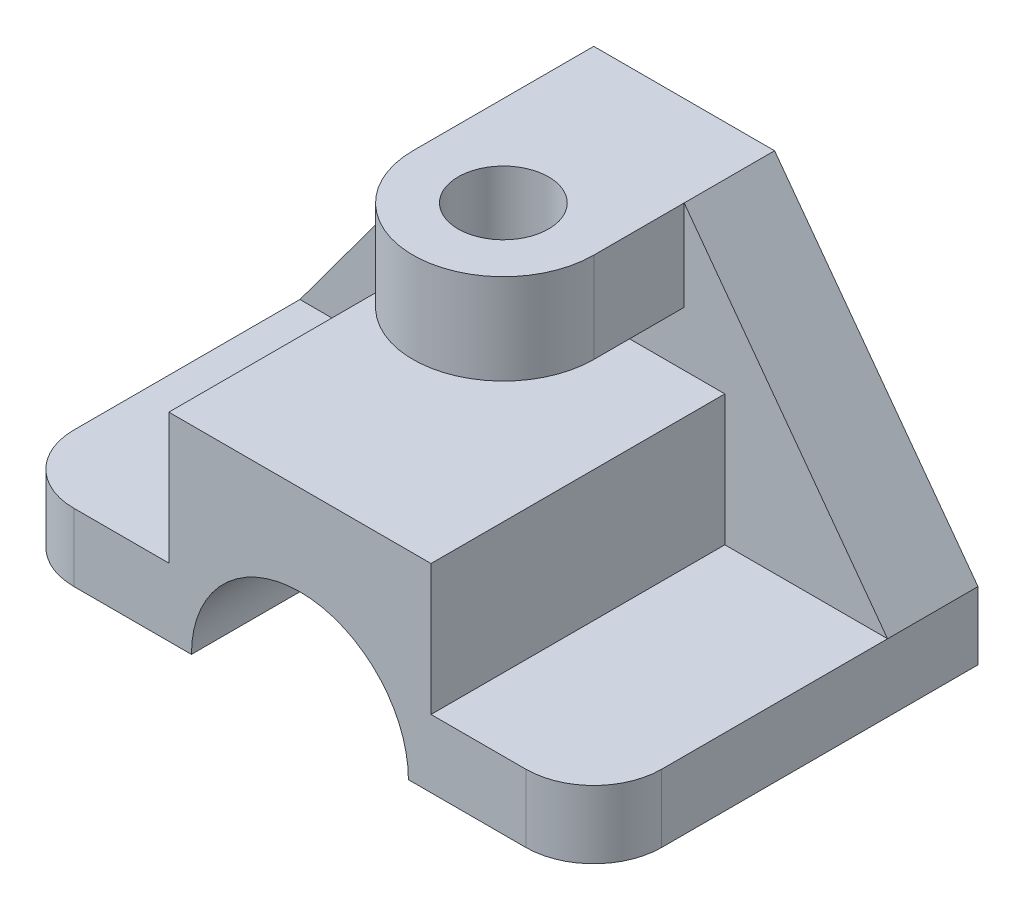
ISO-10303-21;
HEADER;
FILE_DESCRIPTION(('STEP AP214'),'2;1');
FILE_NAME('part.step','',(''),(''),'','','');
FILE_SCHEMA(('AUTOMOTIVE_DESIGN { 1 0 10303 214 1 1 1 1 }'));
ENDSEC;
DATA;
#1=APPLICATION_CONTEXT('core data for automotive mechanical design processes');
#2=APPLICATION_PROTOCOL_DEFINITION('international standard','automotive_design',2000,#1);
#3=PRODUCT_CONTEXT('',#1,'mechanical');
#4=PRODUCT('Part','Part','',(#3));
#5=PRODUCT_RELATED_PRODUCT_CATEGORY('part','',(#4));
#6=PRODUCT_DEFINITION_FORMATION('','',#4);
#7=PRODUCT_DEFINITION_CONTEXT('part definition',#1,'design');
#8=PRODUCT_DEFINITION('design','',#6,#7);
#9=PRODUCT_DEFINITION_SHAPE('','',#8);
#10=(LENGTH_UNIT() NAMED_UNIT(*) SI_UNIT(.MILLI.,.METRE.));
#11=(NAMED_UNIT(*) PLANE_ANGLE_UNIT() SI_UNIT($,.RADIAN.));
#12=(NAMED_UNIT(*) SI_UNIT($,.STERADIAN.) SOLID_ANGLE_UNIT());
#13=UNCERTAINTY_MEASURE_WITH_UNIT(LENGTH_MEASURE(1.E-05),#10,'distance_accuracy_value','');
#14=(GEOMETRIC_REPRESENTATION_CONTEXT(3) GLOBAL_UNCERTAINTY_ASSIGNED_CONTEXT((#13)) GLOBAL_UNIT_ASSIGNED_CONTEXT((#10,
#11,#12)) REPRESENTATION_CONTEXT('',''));
#15=CARTESIAN_POINT('',(0.,0.,0.));
#16=DIRECTION('',(0.,0.,1.));
#17=DIRECTION('',(1.,0.,0.));
#18=AXIS2_PLACEMENT_3D('',#15,#16,#17);
#19=CARTESIAN_POINT('',(-65.,0.,85.));
#20=DIRECTION('',(0.,1.,0.));
#21=DIRECTION('',(0.,0.,1.));
#22=AXIS2_PLACEMENT_3D('',#19,#20,#21);
#23=PLANE('',#22);
#24=DIRECTION('',(0.,0.,-1.));
#25=VECTOR('',#24,1.);
#26=CARTESIAN_POINT('',(65.,0.,85.));
#27=LINE('',#26,#25);
#28=CARTESIAN_POINT('',(65.,0.,70.));
#29=VERTEX_POINT('',#28);
#30=CARTESIAN_POINT('',(65.,0.,0.));
#31=VERTEX_POINT('',#30);
#32=EDGE_CURVE('E321',#29,#31,#27,.T.);
#33=ORIENTED_EDGE('',*,*,#32,.F.);
#34=CARTESIAN_POINT('',(50.,0.,70.));
#35=DIRECTION('',(0.,1.,0.));
#36=DIRECTION('',(0.,0.,1.));
#37=AXIS2_PLACEMENT_3D('',#34,#35,#36);
#38=CIRCLE('',#37,15.);
#39=CARTESIAN_POINT('',(50.,0.,85.));
#40=VERTEX_POINT('',#39);
#41=EDGE_CURVE('E354',#29,#40,#38,.F.);
#42=ORIENTED_EDGE('',*,*,#41,.T.);
#43=DIRECTION('',(1.,0.,0.));
#44=VECTOR('',#43,1.);
#45=CARTESIAN_POINT('',(-65.,0.,85.));
#46=LINE('',#45,#44);
#47=CARTESIAN_POINT('',(24.,0.,85.));
#48=VERTEX_POINT('',#47);
#49=EDGE_CURVE('E272',#48,#40,#46,.T.);
#50=ORIENTED_EDGE('',*,*,#49,.F.);
#51=DIRECTION('',(0.,0.,-1.));
#52=VECTOR('',#51,1.);
#53=CARTESIAN_POINT('',(24.,0.,393.014777533669));
#54=LINE('',#53,#52);
#55=CARTESIAN_POINT('',(24.,0.,0.));
#56=VERTEX_POINT('',#55);
#57=EDGE_CURVE('E247',#48,#56,#54,.T.);
#58=ORIENTED_EDGE('',*,*,#57,.T.);
#59=DIRECTION('',(1.,0.,0.));
#60=VECTOR('',#59,1.);
#61=CARTESIAN_POINT('',(-65.,0.,0.));
#62=LINE('',#61,#60);
#63=EDGE_CURVE('E292',#56,#31,#62,.T.);
#64=ORIENTED_EDGE('',*,*,#63,.T.);
#65=EDGE_LOOP('',(#33,#42,#50,#58,#64));
#66=FACE_BOUND('',#65,.T.);
#67=ADVANCED_FACE('F39',(#66),#23,.F.);
#68=CARTESIAN_POINT('',(-50.,0.,85.));
#69=VERTEX_POINT('',#68);
#70=CARTESIAN_POINT('',(-24.,0.,85.));
#71=VERTEX_POINT('',#70);
#72=EDGE_CURVE('E268',#69,#71,#46,.T.);
#73=ORIENTED_EDGE('',*,*,#72,.F.);
#74=CARTESIAN_POINT('',(-50.,0.,70.));
#75=DIRECTION('',(0.,1.,0.));
#76=DIRECTION('',(0.,0.,1.));
#77=AXIS2_PLACEMENT_3D('',#74,#75,#76);
#78=CIRCLE('',#77,15.);
#79=CARTESIAN_POINT('',(-65.,0.,70.));
#80=VERTEX_POINT('',#79);
#81=EDGE_CURVE('E62',#69,#80,#78,.F.);
#82=ORIENTED_EDGE('',*,*,#81,.T.);
#83=DIRECTION('',(0.,0.,-1.));
#84=VECTOR('',#83,1.);
#85=CARTESIAN_POINT('',(-65.,0.,85.));
#86=LINE('',#85,#84);
#87=CARTESIAN_POINT('',(-65.,0.,0.));
#88=VERTEX_POINT('',#87);
#89=EDGE_CURVE('E324',#80,#88,#86,.T.);
#90=ORIENTED_EDGE('',*,*,#89,.T.);
#91=CARTESIAN_POINT('',(-24.,0.,0.));
#92=VERTEX_POINT('',#91);
#93=EDGE_CURVE('E293',#88,#92,#62,.T.);
#94=ORIENTED_EDGE('',*,*,#93,.T.);
#95=DIRECTION('',(0.,0.,-1.));
#96=VECTOR('',#95,1.);
#97=CARTESIAN_POINT('',(-24.,0.,393.014777533669));
#98=LINE('',#97,#96);
#99=EDGE_CURVE('E257',#71,#92,#98,.T.);
#100=ORIENTED_EDGE('',*,*,#99,.F.);
#101=EDGE_LOOP('',(#73,#82,#90,#94,#100));
#102=FACE_BOUND('',#101,.T.);
#103=ADVANCED_FACE('F407',(#102),#23,.F.);
#104=CARTESIAN_POINT('',(0.,0.,85.));
#105=DIRECTION('',(0.,0.,1.));
#106=DIRECTION('',(1.,0.,0.));
#107=AXIS2_PLACEMENT_3D('',#104,#105,#106);
#108=PLANE('',#107);
#109=ORIENTED_EDGE('',*,*,#49,.T.);
#110=DIRECTION('',(0.,1.,0.));
#111=VECTOR('',#110,1.);
#112=CARTESIAN_POINT('',(50.,15.,85.));
#113=LINE('',#112,#111);
#114=CARTESIAN_POINT('',(50.,15.,85.));
#115=VERTEX_POINT('',#114);
#116=EDGE_CURVE('E344',#40,#115,#113,.T.);
#117=ORIENTED_EDGE('',*,*,#116,.T.);
#118=DIRECTION('',(-1.,0.,0.));
#119=VECTOR('',#118,1.);
#120=CARTESIAN_POINT('',(65.,15.,85.));
#121=LINE('',#120,#119);
#122=CARTESIAN_POINT('',(29.,15.,85.));
#123=VERTEX_POINT('',#122);
#124=EDGE_CURVE('E271',#115,#123,#121,.T.);
#125=ORIENTED_EDGE('',*,*,#124,.T.);
#126=DIRECTION('',(0.,1.,0.));
#127=VECTOR('',#126,1.);
#128=CARTESIAN_POINT('',(29.,15.,85.));
#129=LINE('',#128,#127);
#130=CARTESIAN_POINT('',(29.,43.9178356713427,85.));
#131=VERTEX_POINT('',#130);
#132=EDGE_CURVE('E275',#123,#131,#129,.T.);
#133=ORIENTED_EDGE('',*,*,#132,.T.);
#134=DIRECTION('',(-1.,0.,0.));
#135=VECTOR('',#134,1.);
#136=CARTESIAN_POINT('',(29.,43.9178356713427,85.));
#137=LINE('',#136,#135);
#138=CARTESIAN_POINT('',(-29.,43.9178356713427,85.));
#139=VERTEX_POINT('',#138);
#140=EDGE_CURVE('E278',#131,#139,#137,.T.);
#141=ORIENTED_EDGE('',*,*,#140,.T.);
#142=DIRECTION('',(0.,-1.,0.));
#143=VECTOR('',#142,1.);
#144=CARTESIAN_POINT('',(-29.,43.9178356713427,85.));
#145=LINE('',#144,#143);
#146=CARTESIAN_POINT('',(-29.,15.,85.));
#147=VERTEX_POINT('',#146);
#148=EDGE_CURVE('E281',#139,#147,#145,.T.);
#149=ORIENTED_EDGE('',*,*,#148,.T.);
#150=DIRECTION('',(-1.,0.,0.));
#151=VECTOR('',#150,1.);
#152=CARTESIAN_POINT('',(-29.,15.,85.));
#153=LINE('',#152,#151);
#154=CARTESIAN_POINT('',(-50.,15.,85.));
#155=VERTEX_POINT('',#154);
#156=EDGE_CURVE('E284',#147,#155,#153,.T.);
#157=ORIENTED_EDGE('',*,*,#156,.T.);
#158=DIRECTION('',(0.,-1.,0.));
#159=VECTOR('',#158,1.);
#160=CARTESIAN_POINT('',(-50.,0.,85.));
#161=LINE('',#160,#159);
#162=EDGE_CURVE('E340',#155,#69,#161,.T.);
#163=ORIENTED_EDGE('',*,*,#162,.T.);
#164=ORIENTED_EDGE('',*,*,#72,.T.);
#165=CARTESIAN_POINT('',(0.,0.,85.));
#166=DIRECTION('',(0.,0.,1.));
#167=DIRECTION('',(1.,0.,0.));
#168=AXIS2_PLACEMENT_3D('',#165,#166,#167);
#169=CIRCLE('',#168,24.);
#170=EDGE_CURVE('E261',#71,#48,#169,.F.);
#171=ORIENTED_EDGE('',*,*,#170,.T.);
#172=EDGE_LOOP('',(#109,#117,#125,#133,#141,#149,#157,#163,#164,#171));
#173=FACE_BOUND('',#172,.T.);
#174=ADVANCED_FACE('F396',(#173),#108,.T.);
#175=CARTESIAN_POINT('',(0.,0.,0.));
#176=DIRECTION('',(0.,0.,1.));
#177=DIRECTION('',(1.,0.,0.));
#178=AXIS2_PLACEMENT_3D('',#175,#176,#177);
#179=PLANE('',#178);
#180=DIRECTION('',(1.,0.,0.));
#181=VECTOR('',#180,1.);
#182=CARTESIAN_POINT('',(20.,76.,0.));
#183=LINE('',#182,#181);
#184=CARTESIAN_POINT('',(-20.,76.,0.));
#185=VERTEX_POINT('',#184);
#186=CARTESIAN_POINT('',(20.,76.,0.));
#187=VERTEX_POINT('',#186);
#188=EDGE_CURVE('E236',#185,#187,#183,.T.);
#189=ORIENTED_EDGE('',*,*,#188,.T.);
#190=DIRECTION('',(0.593648948570223,-0.80472413028408,0.));
#191=VECTOR('',#190,1.);
#192=CARTESIAN_POINT('',(65.,15.,0.));
#193=LINE('',#192,#191);
#194=CARTESIAN_POINT('',(65.,15.,0.));
#195=VERTEX_POINT('',#194);
#196=EDGE_CURVE('E211',#187,#195,#193,.T.);
#197=ORIENTED_EDGE('',*,*,#196,.T.);
#198=DIRECTION('',(0.,1.,0.));
#199=VECTOR('',#198,1.);
#200=CARTESIAN_POINT('',(65.,0.,0.));
#201=LINE('',#200,#199);
#202=EDGE_CURVE('E297',#31,#195,#201,.T.);
#203=ORIENTED_EDGE('',*,*,#202,.F.);
#204=ORIENTED_EDGE('',*,*,#63,.F.);
#205=CARTESIAN_POINT('',(0.,0.,0.));
#206=DIRECTION('',(0.,0.,1.));
#207=DIRECTION('',(1.,0.,0.));
#208=AXIS2_PLACEMENT_3D('',#205,#206,#207);
#209=CIRCLE('',#208,24.);
#210=EDGE_CURVE('E327',#92,#56,#209,.F.);
#211=ORIENTED_EDGE('',*,*,#210,.F.);
#212=ORIENTED_EDGE('',*,*,#93,.F.);
#213=DIRECTION('',(0.,-1.,0.));
#214=VECTOR('',#213,1.);
#215=CARTESIAN_POINT('',(-65.,15.,0.));
#216=LINE('',#215,#214);
#217=CARTESIAN_POINT('',(-65.,15.,0.));
#218=VERTEX_POINT('',#217);
#219=EDGE_CURVE('E267',#218,#88,#216,.T.);
#220=ORIENTED_EDGE('',*,*,#219,.F.);
#221=DIRECTION('',(0.593648948570223,0.80472413028408,0.));
#222=VECTOR('',#221,1.);
#223=CARTESIAN_POINT('',(-20.,76.,0.));
#224=LINE('',#223,#222);
#225=EDGE_CURVE('E205',#218,#185,#224,.T.);
#226=ORIENTED_EDGE('',*,*,#225,.T.);
#227=EDGE_LOOP('',(#189,#197,#203,#204,#211,#212,#220,#226));
#228=FACE_BOUND('',#227,.T.);
#229=ADVANCED_FACE('F370',(#228),#179,.F.);
#230=CARTESIAN_POINT('',(-65.,15.,85.));
#231=DIRECTION('',(1.,0.,0.));
#232=DIRECTION('',(0.,0.,-1.));
#233=AXIS2_PLACEMENT_3D('',#230,#231,#232);
#234=PLANE('',#233);
#235=ORIENTED_EDGE('',*,*,#89,.F.);
#236=DIRECTION('',(0.,-1.,0.));
#237=VECTOR('',#236,1.);
#238=CARTESIAN_POINT('',(-65.,15.,70.));
#239=LINE('',#238,#237);
#240=CARTESIAN_POINT('',(-65.,15.,70.));
#241=VERTEX_POINT('',#240);
#242=EDGE_CURVE('E48',#80,#241,#239,.F.);
#243=ORIENTED_EDGE('',*,*,#242,.T.);
#244=DIRECTION('',(0.,0.,-1.));
#245=VECTOR('',#244,1.);
#246=CARTESIAN_POINT('',(-65.,15.,85.));
#247=LINE('',#246,#245);
#248=CARTESIAN_POINT('',(-65.,15.,20.));
#249=VERTEX_POINT('',#248);
#250=EDGE_CURVE('E288',#241,#249,#247,.T.);
#251=ORIENTED_EDGE('',*,*,#250,.T.);
#252=DIRECTION('',(0.,0.,-1.));
#253=VECTOR('',#252,1.);
#254=CARTESIAN_POINT('',(-65.,15.,20.));
#255=LINE('',#254,#253);
#256=EDGE_CURVE('E232',#249,#218,#255,.T.);
#257=ORIENTED_EDGE('',*,*,#256,.T.);
#258=ORIENTED_EDGE('',*,*,#219,.T.);
#259=EDGE_LOOP('',(#235,#243,#251,#257,#258));
#260=FACE_BOUND('',#259,.T.);
#261=ADVANCED_FACE('F408',(#260),#234,.F.);
#262=CARTESIAN_POINT('',(65.,0.,85.));
#263=DIRECTION('',(-1.,0.,0.));
#264=DIRECTION('',(0.,0.,1.));
#265=AXIS2_PLACEMENT_3D('',#262,#263,#264);
#266=PLANE('',#265);
#267=DIRECTION('',(0.,0.,-1.));
#268=VECTOR('',#267,1.);
#269=CARTESIAN_POINT('',(65.,15.,85.));
#270=LINE('',#269,#268);
#271=CARTESIAN_POINT('',(65.,15.,70.));
#272=VERTEX_POINT('',#271);
#273=CARTESIAN_POINT('',(65.,15.,20.));
#274=VERTEX_POINT('',#273);
#275=EDGE_CURVE('E318',#272,#274,#270,.T.);
#276=ORIENTED_EDGE('',*,*,#275,.F.);
#277=DIRECTION('',(0.,1.,0.));
#278=VECTOR('',#277,1.);
#279=CARTESIAN_POINT('',(65.,0.,70.));
#280=LINE('',#279,#278);
#281=EDGE_CURVE('E351',#272,#29,#280,.F.);
#282=ORIENTED_EDGE('',*,*,#281,.T.);
#283=ORIENTED_EDGE('',*,*,#32,.T.);
#284=ORIENTED_EDGE('',*,*,#202,.T.);
#285=DIRECTION('',(0.,0.,-1.));
#286=VECTOR('',#285,1.);
#287=CARTESIAN_POINT('',(65.,15.,20.));
#288=LINE('',#287,#286);
#289=EDGE_CURVE('E243',#274,#195,#288,.T.);
#290=ORIENTED_EDGE('',*,*,#289,.F.);
#291=EDGE_LOOP('',(#276,#282,#283,#284,#290));
#292=FACE_BOUND('',#291,.T.);
#293=ADVANCED_FACE('F375',(#292),#266,.F.);
#294=CARTESIAN_POINT('',(65.,15.,85.));
#295=DIRECTION('',(0.,-1.,0.));
#296=DIRECTION('',(1.,0.,0.));
#297=AXIS2_PLACEMENT_3D('',#294,#295,#296);
#298=PLANE('',#297);
#299=ORIENTED_EDGE('',*,*,#124,.F.);
#300=CARTESIAN_POINT('',(50.,15.,70.));
#301=DIRECTION('',(0.,-1.,0.));
#302=DIRECTION('',(1.,0.,0.));
#303=AXIS2_PLACEMENT_3D('',#300,#301,#302);
#304=CIRCLE('',#303,15.);
#305=EDGE_CURVE('E348',#115,#272,#304,.F.);
#306=ORIENTED_EDGE('',*,*,#305,.T.);
#307=ORIENTED_EDGE('',*,*,#275,.T.);
#308=DIRECTION('',(-1.,0.,0.));
#309=VECTOR('',#308,1.);
#310=CARTESIAN_POINT('',(29.,15.,20.));
#311=LINE('',#310,#309);
#312=CARTESIAN_POINT('',(29.,15.,20.));
#313=VERTEX_POINT('',#312);
#314=EDGE_CURVE('E207',#274,#313,#311,.T.);
#315=ORIENTED_EDGE('',*,*,#314,.T.);
#316=DIRECTION('',(0.,0.,-1.));
#317=VECTOR('',#316,1.);
#318=CARTESIAN_POINT('',(29.,15.,85.));
#319=LINE('',#318,#317);
#320=EDGE_CURVE('E314',#123,#313,#319,.T.);
#321=ORIENTED_EDGE('',*,*,#320,.F.);
#322=EDGE_LOOP('',(#299,#306,#307,#315,#321));
#323=FACE_BOUND('',#322,.T.);
#324=ADVANCED_FACE('F389',(#323),#298,.F.);
#325=CARTESIAN_POINT('',(29.,15.,85.));
#326=DIRECTION('',(-1.,0.,0.));
#327=DIRECTION('',(0.,0.,1.));
#328=AXIS2_PLACEMENT_3D('',#325,#326,#327);
#329=PLANE('',#328);
#330=ORIENTED_EDGE('',*,*,#320,.T.);
#331=DIRECTION('',(0.,1.,0.));
#332=VECTOR('',#331,1.);
#333=CARTESIAN_POINT('',(29.,43.9178356713427,20.));
#334=LINE('',#333,#332);
#335=CARTESIAN_POINT('',(29.,43.9178356713427,20.));
#336=VERTEX_POINT('',#335);
#337=EDGE_CURVE('E210',#313,#336,#334,.T.);
#338=ORIENTED_EDGE('',*,*,#337,.T.);
#339=DIRECTION('',(0.,0.,-1.));
#340=VECTOR('',#339,1.);
#341=CARTESIAN_POINT('',(29.,43.9178356713427,85.));
#342=LINE('',#341,#340);
#343=EDGE_CURVE('E310',#131,#336,#342,.T.);
#344=ORIENTED_EDGE('',*,*,#343,.F.);
#345=ORIENTED_EDGE('',*,*,#132,.F.);
#346=EDGE_LOOP('',(#330,#338,#344,#345));
#347=FACE_BOUND('',#346,.T.);
#348=ADVANCED_FACE('F392',(#347),#329,.F.);
#349=CARTESIAN_POINT('',(29.,43.9178356713427,85.));
#350=DIRECTION('',(0.,-1.,0.));
#351=DIRECTION('',(0.,0.,-1.));
#352=AXIS2_PLACEMENT_3D('',#349,#350,#351);
#353=PLANE('',#352);
#354=ORIENTED_EDGE('',*,*,#343,.T.);
#355=DIRECTION('',(-1.,0.,0.));
#356=VECTOR('',#355,1.);
#357=CARTESIAN_POINT('',(-29.,43.9178356713427,20.));
#358=LINE('',#357,#356);
#359=CARTESIAN_POINT('',(-29.,43.9178356713427,20.));
#360=VERTEX_POINT('',#359);
#361=EDGE_CURVE('E214',#336,#360,#358,.T.);
#362=ORIENTED_EDGE('',*,*,#361,.T.);
#363=DIRECTION('',(0.,0.,-1.));
#364=VECTOR('',#363,1.);
#365=CARTESIAN_POINT('',(-29.,43.9178356713427,85.));
#366=LINE('',#365,#364);
#367=EDGE_CURVE('E306',#139,#360,#366,.T.);
#368=ORIENTED_EDGE('',*,*,#367,.F.);
#369=ORIENTED_EDGE('',*,*,#140,.F.);
#370=EDGE_LOOP('',(#354,#362,#368,#369));
#371=FACE_BOUND('',#370,.T.);
#372=ADVANCED_FACE('F491',(#371),#353,.F.);
#373=CARTESIAN_POINT('',(-29.,43.9178356713427,85.));
#374=DIRECTION('',(1.,0.,0.));
#375=DIRECTION('',(0.,1.,0.));
#376=AXIS2_PLACEMENT_3D('',#373,#374,#375);
#377=PLANE('',#376);
#378=ORIENTED_EDGE('',*,*,#367,.T.);
#379=DIRECTION('',(0.,-1.,0.));
#380=VECTOR('',#379,1.);
#381=CARTESIAN_POINT('',(-29.,15.,20.));
#382=LINE('',#381,#380);
#383=CARTESIAN_POINT('',(-29.,15.,20.));
#384=VERTEX_POINT('',#383);
#385=EDGE_CURVE('E217',#360,#384,#382,.T.);
#386=ORIENTED_EDGE('',*,*,#385,.T.);
#387=DIRECTION('',(0.,0.,-1.));
#388=VECTOR('',#387,1.);
#389=CARTESIAN_POINT('',(-29.,15.,85.));
#390=LINE('',#389,#388);
#391=EDGE_CURVE('E302',#147,#384,#390,.T.);
#392=ORIENTED_EDGE('',*,*,#391,.F.);
#393=ORIENTED_EDGE('',*,*,#148,.F.);
#394=EDGE_LOOP('',(#378,#386,#392,#393));
#395=FACE_BOUND('',#394,.T.);
#396=ADVANCED_FACE('F418',(#395),#377,.F.);
#397=CARTESIAN_POINT('',(-29.,15.,85.));
#398=DIRECTION('',(0.,-1.,0.));
#399=DIRECTION('',(1.,0.,0.));
#400=AXIS2_PLACEMENT_3D('',#397,#398,#399);
#401=PLANE('',#400);
#402=ORIENTED_EDGE('',*,*,#250,.F.);
#403=CARTESIAN_POINT('',(-50.,15.,70.));
#404=DIRECTION('',(0.,-1.,0.));
#405=DIRECTION('',(1.,0.,0.));
#406=AXIS2_PLACEMENT_3D('',#403,#404,#405);
#407=CIRCLE('',#406,15.);
#408=EDGE_CURVE('E11',#241,#155,#407,.F.);
#409=ORIENTED_EDGE('',*,*,#408,.T.);
#410=ORIENTED_EDGE('',*,*,#156,.F.);
#411=ORIENTED_EDGE('',*,*,#391,.T.);
#412=DIRECTION('',(-1.,0.,0.));
#413=VECTOR('',#412,1.);
#414=CARTESIAN_POINT('',(-65.,15.,20.));
#415=LINE('',#414,#413);
#416=EDGE_CURVE('E220',#384,#249,#415,.T.);
#417=ORIENTED_EDGE('',*,*,#416,.T.);
#418=EDGE_LOOP('',(#402,#409,#410,#411,#417));
#419=FACE_BOUND('',#418,.T.);
#420=ADVANCED_FACE('F414',(#419),#401,.F.);
#421=CARTESIAN_POINT('',(0.,0.,393.014777533669));
#422=DIRECTION('',(0.,0.,-1.));
#423=DIRECTION('',(-1.,0.,0.));
#424=AXIS2_PLACEMENT_3D('',#421,#422,#423);
#425=CYLINDRICAL_SURFACE('',#424,24.);
#426=ORIENTED_EDGE('',*,*,#170,.F.);
#427=ORIENTED_EDGE('',*,*,#99,.T.);
#428=ORIENTED_EDGE('',*,*,#210,.T.);
#429=ORIENTED_EDGE('',*,*,#57,.F.);
#430=EDGE_LOOP('',(#426,#427,#428,#429));
#431=FACE_BOUND('',#430,.T.);
#432=ADVANCED_FACE('F405',(#431),#425,.F.);
#433=CARTESIAN_POINT('',(65.,15.,20.));
#434=DIRECTION('',(0.80472413028408,0.593648948570223,0.));
#435=DIRECTION('',(-0.593648948570223,0.80472413028408,0.));
#436=AXIS2_PLACEMENT_3D('',#433,#434,#435);
#437=PLANE('',#436);
#438=ORIENTED_EDGE('',*,*,#196,.F.);
#439=DIRECTION('',(0.,0.,-1.));
#440=VECTOR('',#439,1.);
#441=CARTESIAN_POINT('',(20.,76.,20.));
#442=LINE('',#441,#440);
#443=CARTESIAN_POINT('',(20.,76.,20.));
#444=VERTEX_POINT('',#443);
#445=EDGE_CURVE('E248',#444,#187,#442,.T.);
#446=ORIENTED_EDGE('',*,*,#445,.F.);
#447=DIRECTION('',(0.593648948570223,-0.80472413028408,0.));
#448=VECTOR('',#447,1.);
#449=CARTESIAN_POINT('',(65.,15.,20.));
#450=LINE('',#449,#448);
#451=EDGE_CURVE('E228',#444,#274,#450,.T.);
#452=ORIENTED_EDGE('',*,*,#451,.T.);
#453=ORIENTED_EDGE('',*,*,#289,.T.);
#454=EDGE_LOOP('',(#438,#446,#452,#453));
#455=FACE_BOUND('',#454,.T.);
#456=ADVANCED_FACE('F378',(#455),#437,.T.);
#457=CARTESIAN_POINT('',(20.,76.,20.));
#458=DIRECTION('',(0.,1.,0.));
#459=DIRECTION('',(0.,0.,1.));
#460=AXIS2_PLACEMENT_3D('',#457,#458,#459);
#461=PLANE('',#460);
#462=ORIENTED_EDGE('',*,*,#188,.F.);
#463=DIRECTION('',(0.,0.,-1.));
#464=VECTOR('',#463,1.);
#465=CARTESIAN_POINT('',(-20.,76.,20.));
#466=LINE('',#465,#464);
#467=CARTESIAN_POINT('',(-20.,76.,20.));
#468=VERTEX_POINT('',#467);
#469=EDGE_CURVE('E251',#468,#185,#466,.T.);
#470=ORIENTED_EDGE('',*,*,#469,.F.);
#471=DIRECTION('',(0.,0.,1.));
#472=VECTOR('',#471,1.);
#473=CARTESIAN_POINT('',(-20.,76.,0.));
#474=LINE('',#473,#472);
#475=CARTESIAN_POINT('',(-20.,76.,40.));
#476=VERTEX_POINT('',#475);
#477=EDGE_CURVE('E196',#468,#476,#474,.T.);
#478=ORIENTED_EDGE('',*,*,#477,.T.);
#479=CARTESIAN_POINT('',(0.,76.,40.));
#480=DIRECTION('',(0.,1.,0.));
#481=DIRECTION('',(0.,0.,1.));
#482=AXIS2_PLACEMENT_3D('',#479,#480,#481);
#483=CIRCLE('',#482,20.);
#484=CARTESIAN_POINT('',(20.,76.,40.));
#485=VERTEX_POINT('',#484);
#486=EDGE_CURVE('E182',#476,#485,#483,.T.);
#487=ORIENTED_EDGE('',*,*,#486,.T.);
#488=DIRECTION('',(0.,0.,-1.));
#489=VECTOR('',#488,1.);
#490=CARTESIAN_POINT('',(20.,76.,0.));
#491=LINE('',#490,#489);
#492=EDGE_CURVE('E175',#485,#444,#491,.T.);
#493=ORIENTED_EDGE('',*,*,#492,.T.);
#494=ORIENTED_EDGE('',*,*,#445,.T.);
#495=EDGE_LOOP('',(#462,#470,#478,#487,#493,#494));
#496=FACE_BOUND('',#495,.T.);
#497=CARTESIAN_POINT('',(0.,76.,40.));
#498=DIRECTION('',(0.,1.,0.));
#499=DIRECTION('',(0.,0.,1.));
#500=AXIS2_PLACEMENT_3D('',#497,#498,#499);
#501=CIRCLE('',#500,10.);
#502=CARTESIAN_POINT('',(0.,76.,50.));
#503=VERTEX_POINT('',#502);
#504=EDGE_CURVE('E468',#503,#503,#501,.T.);
#505=ORIENTED_EDGE('',*,*,#504,.F.);
#506=EDGE_LOOP('',(#505));
#507=FACE_BOUND('',#506,.T.);
#508=ADVANCED_FACE('F429',(#496,#507),#461,.T.);
#509=CARTESIAN_POINT('',(-20.,76.,20.));
#510=DIRECTION('',(-0.80472413028408,0.593648948570223,0.));
#511=DIRECTION('',(-0.593648948570223,-0.80472413028408,0.));
#512=AXIS2_PLACEMENT_3D('',#509,#510,#511);
#513=PLANE('',#512);
#514=ORIENTED_EDGE('',*,*,#225,.F.);
#515=ORIENTED_EDGE('',*,*,#256,.F.);
#516=DIRECTION('',(0.593648948570223,0.80472413028408,0.));
#517=VECTOR('',#516,1.);
#518=CARTESIAN_POINT('',(-20.,76.,20.));
#519=LINE('',#518,#517);
#520=EDGE_CURVE('E224',#249,#468,#519,.T.);
#521=ORIENTED_EDGE('',*,*,#520,.T.);
#522=ORIENTED_EDGE('',*,*,#469,.T.);
#523=EDGE_LOOP('',(#514,#515,#521,#522));
#524=FACE_BOUND('',#523,.T.);
#525=ADVANCED_FACE('F426',(#524),#513,.T.);
#526=CARTESIAN_POINT('',(0.,0.,20.));
#527=DIRECTION('',(0.,0.,1.));
#528=DIRECTION('',(1.,0.,0.));
#529=AXIS2_PLACEMENT_3D('',#526,#527,#528);
#530=PLANE('',#529);
#531=DIRECTION('',(0.,1.,0.));
#532=VECTOR('',#531,1.);
#533=CARTESIAN_POINT('',(20.,0.,20.));
#534=LINE('',#533,#532);
#535=CARTESIAN_POINT('',(20.,56.,20.));
#536=VERTEX_POINT('',#535);
#537=EDGE_CURVE('E336',#536,#444,#534,.T.);
#538=ORIENTED_EDGE('',*,*,#537,.F.);
#539=DIRECTION('',(-1.,0.,0.));
#540=VECTOR('',#539,1.);
#541=CARTESIAN_POINT('',(0.,56.,20.));
#542=LINE('',#541,#540);
#543=CARTESIAN_POINT('',(-20.,56.,20.));
#544=VERTEX_POINT('',#543);
#545=EDGE_CURVE('E331',#536,#544,#542,.T.);
#546=ORIENTED_EDGE('',*,*,#545,.T.);
#547=DIRECTION('',(0.,-1.,0.));
#548=VECTOR('',#547,1.);
#549=CARTESIAN_POINT('',(-20.,0.,20.));
#550=LINE('',#549,#548);
#551=EDGE_CURVE('E169',#468,#544,#550,.T.);
#552=ORIENTED_EDGE('',*,*,#551,.F.);
#553=ORIENTED_EDGE('',*,*,#520,.F.);
#554=ORIENTED_EDGE('',*,*,#416,.F.);
#555=ORIENTED_EDGE('',*,*,#385,.F.);
#556=ORIENTED_EDGE('',*,*,#361,.F.);
#557=ORIENTED_EDGE('',*,*,#337,.F.);
#558=ORIENTED_EDGE('',*,*,#314,.F.);
#559=ORIENTED_EDGE('',*,*,#451,.F.);
#560=EDGE_LOOP('',(#538,#546,#552,#553,#554,#555,#556,#557,#558,#559));
#561=FACE_BOUND('',#560,.T.);
#562=ADVANCED_FACE('F383',(#561),#530,.T.);
#563=CARTESIAN_POINT('',(20.,56.,0.));
#564=DIRECTION('',(1.,0.,0.));
#565=DIRECTION('',(0.,0.,-1.));
#566=AXIS2_PLACEMENT_3D('',#563,#564,#565);
#567=PLANE('',#566);
#568=DIRECTION('',(0.,0.,-1.));
#569=VECTOR('',#568,1.);
#570=CARTESIAN_POINT('',(20.,56.,0.));
#571=LINE('',#570,#569);
#572=CARTESIAN_POINT('',(20.,56.,40.));
#573=VERTEX_POINT('',#572);
#574=EDGE_CURVE('E185',#573,#536,#571,.T.);
#575=ORIENTED_EDGE('',*,*,#574,.T.);
#576=ORIENTED_EDGE('',*,*,#537,.T.);
#577=ORIENTED_EDGE('',*,*,#492,.F.);
#578=DIRECTION('',(0.,1.,0.));
#579=VECTOR('',#578,1.);
#580=CARTESIAN_POINT('',(20.,56.,40.));
#581=LINE('',#580,#579);
#582=EDGE_CURVE('E184',#573,#485,#581,.T.);
#583=ORIENTED_EDGE('',*,*,#582,.F.);
#584=EDGE_LOOP('',(#575,#576,#577,#583));
#585=FACE_BOUND('',#584,.T.);
#586=ADVANCED_FACE('F433',(#585),#567,.T.);
#587=CARTESIAN_POINT('',(0.,56.,40.));
#588=DIRECTION('',(0.,1.,0.));
#589=DIRECTION('',(0.,0.,1.));
#590=AXIS2_PLACEMENT_3D('',#587,#588,#589);
#591=CYLINDRICAL_SURFACE('',#590,20.);
#592=ORIENTED_EDGE('',*,*,#486,.F.);
#593=DIRECTION('',(0.,1.,0.));
#594=VECTOR('',#593,1.);
#595=CARTESIAN_POINT('',(-20.,56.,40.));
#596=LINE('',#595,#594);
#597=CARTESIAN_POINT('',(-20.,56.,40.));
#598=VERTEX_POINT('',#597);
#599=EDGE_CURVE('E166',#598,#476,#596,.T.);
#600=ORIENTED_EDGE('',*,*,#599,.F.);
#601=CARTESIAN_POINT('',(0.,56.,40.));
#602=DIRECTION('',(0.,1.,0.));
#603=DIRECTION('',(0.,0.,1.));
#604=AXIS2_PLACEMENT_3D('',#601,#602,#603);
#605=CIRCLE('',#604,20.);
#606=EDGE_CURVE('E174',#598,#573,#605,.T.);
#607=ORIENTED_EDGE('',*,*,#606,.T.);
#608=ORIENTED_EDGE('',*,*,#582,.T.);
#609=EDGE_LOOP('',(#592,#600,#607,#608));
#610=FACE_BOUND('',#609,.T.);
#611=ADVANCED_FACE('F179',(#610),#591,.T.);
#612=CARTESIAN_POINT('',(-20.,56.,0.));
#613=DIRECTION('',(-1.,0.,0.));
#614=DIRECTION('',(0.,0.,1.));
#615=AXIS2_PLACEMENT_3D('',#612,#613,#614);
#616=PLANE('',#615);
#617=ORIENTED_EDGE('',*,*,#477,.F.);
#618=ORIENTED_EDGE('',*,*,#551,.T.);
#619=DIRECTION('',(0.,0.,1.));
#620=VECTOR('',#619,1.);
#621=CARTESIAN_POINT('',(-20.,56.,0.));
#622=LINE('',#621,#620);
#623=EDGE_CURVE('E163',#544,#598,#622,.T.);
#624=ORIENTED_EDGE('',*,*,#623,.T.);
#625=ORIENTED_EDGE('',*,*,#599,.T.);
#626=EDGE_LOOP('',(#617,#618,#624,#625));
#627=FACE_BOUND('',#626,.T.);
#628=ADVANCED_FACE('F165',(#627),#616,.T.);
#629=CARTESIAN_POINT('',(0.,56.,40.));
#630=DIRECTION('',(0.,1.,0.));
#631=DIRECTION('',(0.,0.,1.));
#632=AXIS2_PLACEMENT_3D('',#629,#630,#631);
#633=PLANE('',#632);
#634=ORIENTED_EDGE('',*,*,#545,.F.);
#635=ORIENTED_EDGE('',*,*,#574,.F.);
#636=ORIENTED_EDGE('',*,*,#606,.F.);
#637=ORIENTED_EDGE('',*,*,#623,.F.);
#638=EDGE_LOOP('',(#634,#635,#636,#637));
#639=FACE_BOUND('',#638,.T.);
#640=CARTESIAN_POINT('',(0.,56.,40.));
#641=DIRECTION('',(0.,1.,0.));
#642=DIRECTION('',(0.,0.,1.));
#643=AXIS2_PLACEMENT_3D('',#640,#641,#642);
#644=CIRCLE('',#643,10.);
#645=CARTESIAN_POINT('',(0.,56.,50.));
#646=VERTEX_POINT('',#645);
#647=EDGE_CURVE('E199',#646,#646,#644,.T.);
#648=ORIENTED_EDGE('',*,*,#647,.T.);
#649=EDGE_LOOP('',(#648));
#650=FACE_BOUND('',#649,.T.);
#651=ADVANCED_FACE('F187',(#639,#650),#633,.F.);
#652=CARTESIAN_POINT('',(0.,56.,40.));
#653=DIRECTION('',(0.,1.,0.));
#654=DIRECTION('',(0.,0.,1.));
#655=AXIS2_PLACEMENT_3D('',#652,#653,#654);
#656=CYLINDRICAL_SURFACE('',#655,10.);
#657=ORIENTED_EDGE('',*,*,#647,.F.);
#658=EDGE_LOOP('',(#657));
#659=FACE_BOUND('',#658,.T.);
#660=ORIENTED_EDGE('',*,*,#504,.T.);
#661=EDGE_LOOP('',(#660));
#662=FACE_BOUND('',#661,.T.);
#663=ADVANCED_FACE('F453',(#659,#662),#656,.F.);
#664=CARTESIAN_POINT('',(50.,0.,70.));
#665=DIRECTION('',(0.,-1.,0.));
#666=DIRECTION('',(0.,0.,-1.));
#667=AXIS2_PLACEMENT_3D('',#664,#665,#666);
#668=CYLINDRICAL_SURFACE('',#667,15.);
#669=ORIENTED_EDGE('',*,*,#41,.F.);
#670=ORIENTED_EDGE('',*,*,#281,.F.);
#671=ORIENTED_EDGE('',*,*,#305,.F.);
#672=ORIENTED_EDGE('',*,*,#116,.F.);
#673=EDGE_LOOP('',(#669,#670,#671,#672));
#674=FACE_BOUND('',#673,.T.);
#675=ADVANCED_FACE('F401',(#674),#668,.T.);
#676=CARTESIAN_POINT('',(-50.,0.,70.));
#677=DIRECTION('',(0.,1.,0.));
#678=DIRECTION('',(0.,0.,1.));
#679=AXIS2_PLACEMENT_3D('',#676,#677,#678);
#680=CYLINDRICAL_SURFACE('',#679,15.);
#681=ORIENTED_EDGE('',*,*,#408,.F.);
#682=ORIENTED_EDGE('',*,*,#242,.F.);
#683=ORIENTED_EDGE('',*,*,#81,.F.);
#684=ORIENTED_EDGE('',*,*,#162,.F.);
#685=EDGE_LOOP('',(#681,#682,#683,#684));
#686=FACE_BOUND('',#685,.T.);
#687=ADVANCED_FACE('F41',(#686),#680,.T.);
#688=CLOSED_SHELL('',(#67,#103,#174,#229,#261,#293,#324,#348,#372,#396,#420,#432,#456,#508,#525,
#562,#586,#611,#628,#651,#663,#675,#687));
#689=MANIFOLD_SOLID_BREP('B2',#688);
#690=ADVANCED_BREP_SHAPE_REPRESENTATION('',(#18,#689),#14);
#691=SHAPE_DEFINITION_REPRESENTATION(#9,#690);
ENDSEC;
END-ISO-10303-21;
